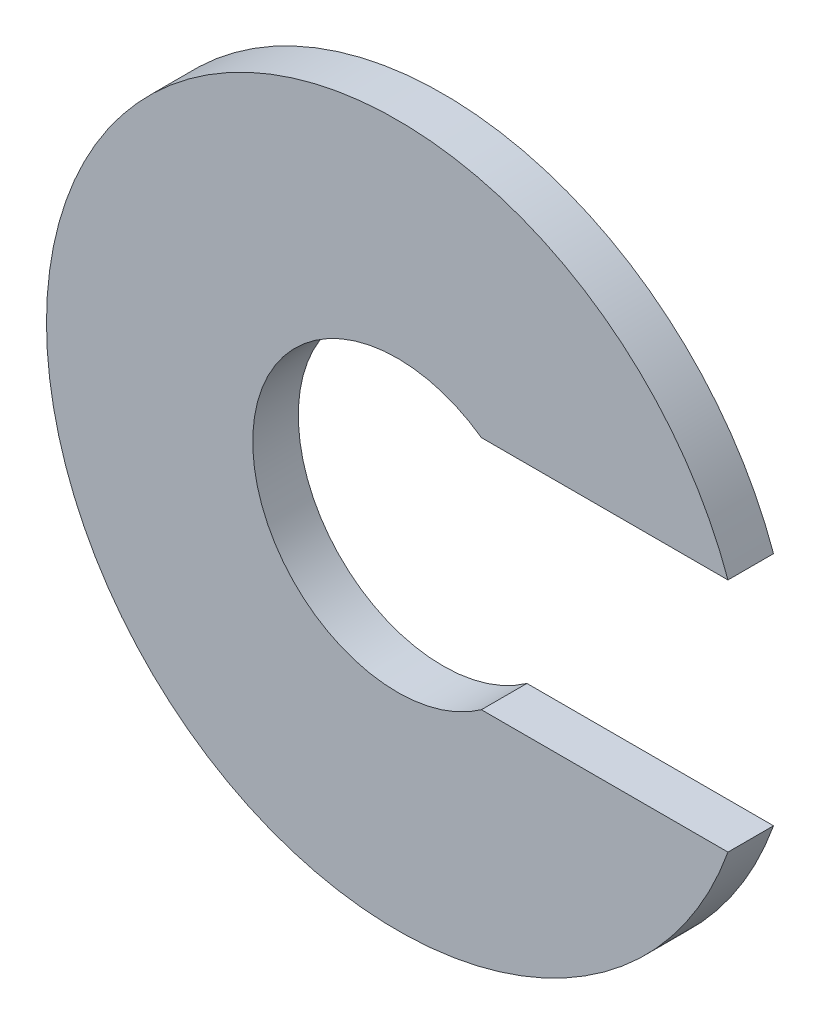
ISO-10303-21;
HEADER;
FILE_DESCRIPTION(('STEP AP214'),'2;1');
FILE_NAME('part.step','',(''),(''),'','','');
FILE_SCHEMA(('AUTOMOTIVE_DESIGN { 1 0 10303 214 1 1 1 1 }'));
ENDSEC;
DATA;
#1=APPLICATION_CONTEXT('core data for automotive mechanical design processes');
#2=APPLICATION_PROTOCOL_DEFINITION('international standard','automotive_design',2000,#1);
#3=PRODUCT_CONTEXT('',#1,'mechanical');
#4=PRODUCT('Part','Part','',(#3));
#5=PRODUCT_RELATED_PRODUCT_CATEGORY('part','',(#4));
#6=PRODUCT_DEFINITION_FORMATION('','',#4);
#7=PRODUCT_DEFINITION_CONTEXT('part definition',#1,'design');
#8=PRODUCT_DEFINITION('design','',#6,#7);
#9=PRODUCT_DEFINITION_SHAPE('','',#8);
#10=(LENGTH_UNIT() NAMED_UNIT(*) SI_UNIT(.MILLI.,.METRE.));
#11=(NAMED_UNIT(*) PLANE_ANGLE_UNIT() SI_UNIT($,.RADIAN.));
#12=(NAMED_UNIT(*) SI_UNIT($,.STERADIAN.) SOLID_ANGLE_UNIT());
#13=UNCERTAINTY_MEASURE_WITH_UNIT(LENGTH_MEASURE(1.E-05),#10,'distance_accuracy_value','');
#14=(GEOMETRIC_REPRESENTATION_CONTEXT(3) GLOBAL_UNCERTAINTY_ASSIGNED_CONTEXT((#13)) GLOBAL_UNIT_ASSIGNED_CONTEXT((#10,
#11,#12)) REPRESENTATION_CONTEXT('',''));
#15=CARTESIAN_POINT('',(0.,0.,0.));
#16=DIRECTION('',(0.,0.,1.));
#17=DIRECTION('',(1.,0.,0.));
#18=AXIS2_PLACEMENT_3D('',#15,#16,#17);
#19=CARTESIAN_POINT('',(0.,0.,0.739999999999991));
#20=DIRECTION('',(0.,0.,1.));
#21=DIRECTION('',(-1.,0.,0.));
#22=AXIS2_PLACEMENT_3D('',#19,#20,#21);
#23=PLANE('',#22);
#24=CARTESIAN_POINT('',(0.,0.,0.739999999999991));
#25=DIRECTION('',(0.,0.,1.));
#26=DIRECTION('',(1.,0.,0.));
#27=AXIS2_PLACEMENT_3D('',#24,#25,#26);
#28=CIRCLE('',#27,2.35000000000001);
#29=CARTESIAN_POINT('',(1.36381816969866,1.91376592090042,0.739999999999991));
#30=VERTEX_POINT('',#29);
#31=CARTESIAN_POINT('',(1.36381816969866,-1.91376592090042,0.739999999999991));
#32=VERTEX_POINT('',#31);
#33=EDGE_CURVE('E50',#30,#32,#28,.T.);
#34=ORIENTED_EDGE('',*,*,#33,.F.);
#35=DIRECTION('',(1.,0.,0.));
#36=VECTOR('',#35,1.);
#37=CARTESIAN_POINT('',(1.36381816969867,1.91376592090042,0.739999999999991));
#38=LINE('',#37,#36);
#39=CARTESIAN_POINT('',(5.36912469588854,1.91376592090042,0.739999999999994));
#40=VERTEX_POINT('',#39);
#41=EDGE_CURVE('E68',#30,#40,#38,.T.);
#42=ORIENTED_EDGE('',*,*,#41,.T.);
#43=CARTESIAN_POINT('',(0.,0.,0.739999999999991));
#44=DIRECTION('',(0.,0.,1.));
#45=DIRECTION('',(1.,0.,0.));
#46=AXIS2_PLACEMENT_3D('',#43,#44,#45);
#47=CIRCLE('',#46,5.7);
#48=CARTESIAN_POINT('',(5.36912469588854,-1.91376592090042,0.739999999999991));
#49=VERTEX_POINT('',#48);
#50=EDGE_CURVE('E71',#40,#49,#47,.T.);
#51=ORIENTED_EDGE('',*,*,#50,.T.);
#52=DIRECTION('',(1.,0.,0.));
#53=VECTOR('',#52,1.);
#54=CARTESIAN_POINT('',(1.36381816969867,-1.91376592090042,0.739999999999991));
#55=LINE('',#54,#53);
#56=EDGE_CURVE('E88',#32,#49,#55,.T.);
#57=ORIENTED_EDGE('',*,*,#56,.F.);
#58=EDGE_LOOP('',(#34,#42,#51,#57));
#59=FACE_BOUND('',#58,.T.);
#60=ADVANCED_FACE('F39',(#59),#23,.T.);
#61=CARTESIAN_POINT('',(0.,0.,0.));
#62=DIRECTION('',(0.,0.,1.));
#63=DIRECTION('',(1.,0.,0.));
#64=AXIS2_PLACEMENT_3D('',#61,#62,#63);
#65=PLANE('',#64);
#66=CARTESIAN_POINT('',(0.,0.,0.));
#67=DIRECTION('',(0.,0.,1.));
#68=DIRECTION('',(1.,0.,0.));
#69=AXIS2_PLACEMENT_3D('',#66,#67,#68);
#70=CIRCLE('',#69,2.35000000000001);
#71=CARTESIAN_POINT('',(1.36381816969866,1.91376592090042,0.));
#72=VERTEX_POINT('',#71);
#73=CARTESIAN_POINT('',(1.36381816969866,-1.91376592090042,0.));
#74=VERTEX_POINT('',#73);
#75=EDGE_CURVE('E100',#72,#74,#70,.T.);
#76=ORIENTED_EDGE('',*,*,#75,.T.);
#77=DIRECTION('',(1.,0.,0.));
#78=VECTOR('',#77,1.);
#79=CARTESIAN_POINT('',(1.36381816969866,-1.91376592090042,0.));
#80=LINE('',#79,#78);
#81=CARTESIAN_POINT('',(5.36912469588854,-1.91376592090042,0.));
#82=VERTEX_POINT('',#81);
#83=EDGE_CURVE('E90',#74,#82,#80,.T.);
#84=ORIENTED_EDGE('',*,*,#83,.T.);
#85=CARTESIAN_POINT('',(0.,0.,0.));
#86=DIRECTION('',(0.,0.,1.));
#87=DIRECTION('',(1.,0.,0.));
#88=AXIS2_PLACEMENT_3D('',#85,#86,#87);
#89=CIRCLE('',#88,5.7);
#90=CARTESIAN_POINT('',(5.36912469588854,1.91376592090042,0.));
#91=VERTEX_POINT('',#90);
#92=EDGE_CURVE('E95',#91,#82,#89,.T.);
#93=ORIENTED_EDGE('',*,*,#92,.F.);
#94=DIRECTION('',(1.,0.,0.));
#95=VECTOR('',#94,1.);
#96=CARTESIAN_POINT('',(1.36381816969866,1.91376592090042,0.));
#97=LINE('',#96,#95);
#98=EDGE_CURVE('E106',#72,#91,#97,.T.);
#99=ORIENTED_EDGE('',*,*,#98,.F.);
#100=EDGE_LOOP('',(#76,#84,#93,#99));
#101=FACE_BOUND('',#100,.T.);
#102=ADVANCED_FACE('F96',(#101),#65,.F.);
#103=CARTESIAN_POINT('',(1.36381816969866,-1.91376592090042,16.6297929984355));
#104=DIRECTION('',(0.,1.,0.));
#105=DIRECTION('',(-1.,0.,0.));
#106=AXIS2_PLACEMENT_3D('',#103,#104,#105);
#107=PLANE('',#106);
#108=DIRECTION('',(0.,0.,-1.));
#109=VECTOR('',#108,1.);
#110=CARTESIAN_POINT('',(1.36381816969866,-1.91376592090042,16.6297929984355));
#111=LINE('',#110,#109);
#112=EDGE_CURVE('E11',#32,#74,#111,.T.);
#113=ORIENTED_EDGE('',*,*,#112,.F.);
#114=ORIENTED_EDGE('',*,*,#56,.T.);
#115=DIRECTION('',(0.,0.,-1.));
#116=VECTOR('',#115,1.);
#117=CARTESIAN_POINT('',(5.36912469588854,-1.91376592090042,16.6297929984355));
#118=LINE('',#117,#116);
#119=EDGE_CURVE('E82',#49,#82,#118,.T.);
#120=ORIENTED_EDGE('',*,*,#119,.T.);
#121=ORIENTED_EDGE('',*,*,#83,.F.);
#122=EDGE_LOOP('',(#113,#114,#120,#121));
#123=FACE_BOUND('',#122,.T.);
#124=ADVANCED_FACE('F87',(#123),#107,.T.);
#125=CARTESIAN_POINT('',(0.,0.,16.6297929984355));
#126=DIRECTION('',(0.,0.,-1.));
#127=DIRECTION('',(-1.,0.,0.));
#128=AXIS2_PLACEMENT_3D('',#125,#126,#127);
#129=CYLINDRICAL_SURFACE('',#128,5.7);
#130=ORIENTED_EDGE('',*,*,#50,.F.);
#131=DIRECTION('',(0.,0.,-1.));
#132=VECTOR('',#131,1.);
#133=CARTESIAN_POINT('',(5.36912469588854,1.91376592090042,16.6297929984355));
#134=LINE('',#133,#132);
#135=EDGE_CURVE('E78',#40,#91,#134,.T.);
#136=ORIENTED_EDGE('',*,*,#135,.T.);
#137=ORIENTED_EDGE('',*,*,#92,.T.);
#138=ORIENTED_EDGE('',*,*,#119,.F.);
#139=EDGE_LOOP('',(#130,#136,#137,#138));
#140=FACE_BOUND('',#139,.T.);
#141=ADVANCED_FACE('F93',(#140),#129,.T.);
#142=CARTESIAN_POINT('',(1.36381816969866,1.91376592090042,16.6297929984355));
#143=DIRECTION('',(0.,1.,0.));
#144=DIRECTION('',(-1.,0.,0.));
#145=AXIS2_PLACEMENT_3D('',#142,#143,#144);
#146=PLANE('',#145);
#147=ORIENTED_EDGE('',*,*,#41,.F.);
#148=DIRECTION('',(0.,0.,-1.));
#149=VECTOR('',#148,1.);
#150=CARTESIAN_POINT('',(1.36381816969866,1.91376592090042,16.6297929984355));
#151=LINE('',#150,#149);
#152=EDGE_CURVE('E98',#30,#72,#151,.T.);
#153=ORIENTED_EDGE('',*,*,#152,.T.);
#154=ORIENTED_EDGE('',*,*,#98,.T.);
#155=ORIENTED_EDGE('',*,*,#135,.F.);
#156=EDGE_LOOP('',(#147,#153,#154,#155));
#157=FACE_BOUND('',#156,.T.);
#158=ADVANCED_FACE('F115',(#157),#146,.F.);
#159=CARTESIAN_POINT('',(0.,0.,16.6297929984355));
#160=DIRECTION('',(0.,0.,-1.));
#161=DIRECTION('',(-1.,0.,0.));
#162=AXIS2_PLACEMENT_3D('',#159,#160,#161);
#163=CYLINDRICAL_SURFACE('',#162,2.35000000000001);
#164=ORIENTED_EDGE('',*,*,#152,.F.);
#165=ORIENTED_EDGE('',*,*,#33,.T.);
#166=ORIENTED_EDGE('',*,*,#112,.T.);
#167=ORIENTED_EDGE('',*,*,#75,.F.);
#168=EDGE_LOOP('',(#164,#165,#166,#167));
#169=FACE_BOUND('',#168,.T.);
#170=ADVANCED_FACE('F113',(#169),#163,.F.);
#171=CLOSED_SHELL('',(#60,#102,#124,#141,#158,#170));
#172=MANIFOLD_SOLID_BREP('B2',#171);
#173=ADVANCED_BREP_SHAPE_REPRESENTATION('',(#18,#172),#14);
#174=SHAPE_DEFINITION_REPRESENTATION(#9,#173);
ENDSEC;
END-ISO-10303-21;
